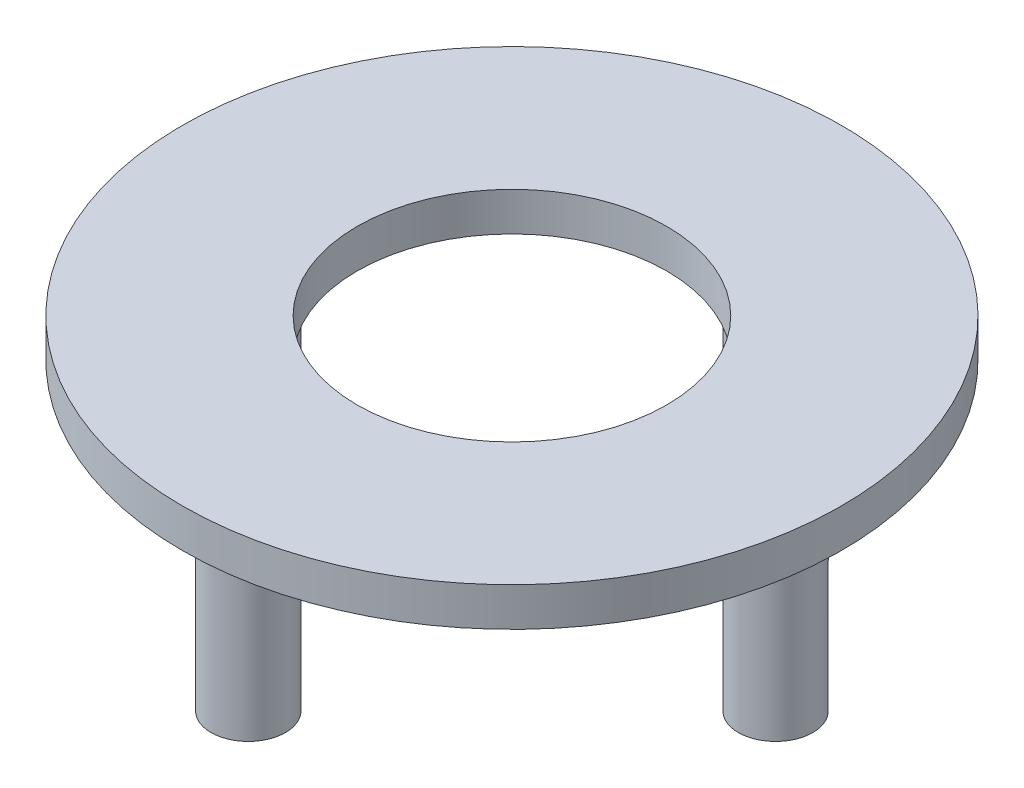
ISO-10303-21;
HEADER;
FILE_DESCRIPTION(('STEP AP214'),'2;1');
FILE_NAME('part.step','',(''),(''),'','','');
FILE_SCHEMA(('AUTOMOTIVE_DESIGN { 1 0 10303 214 1 1 1 1 }'));
ENDSEC;
DATA;
#1=APPLICATION_CONTEXT('core data for automotive mechanical design processes');
#2=APPLICATION_PROTOCOL_DEFINITION('international standard','automotive_design',2000,#1);
#3=PRODUCT_CONTEXT('',#1,'mechanical');
#4=PRODUCT('Part','Part','',(#3));
#5=PRODUCT_RELATED_PRODUCT_CATEGORY('part','',(#4));
#6=PRODUCT_DEFINITION_FORMATION('','',#4);
#7=PRODUCT_DEFINITION_CONTEXT('part definition',#1,'design');
#8=PRODUCT_DEFINITION('design','',#6,#7);
#9=PRODUCT_DEFINITION_SHAPE('','',#8);
#10=(LENGTH_UNIT() NAMED_UNIT(*) SI_UNIT(.MILLI.,.METRE.));
#11=(NAMED_UNIT(*) PLANE_ANGLE_UNIT() SI_UNIT($,.RADIAN.));
#12=(NAMED_UNIT(*) SI_UNIT($,.STERADIAN.) SOLID_ANGLE_UNIT());
#13=UNCERTAINTY_MEASURE_WITH_UNIT(LENGTH_MEASURE(1.E-05),#10,'distance_accuracy_value','');
#14=(GEOMETRIC_REPRESENTATION_CONTEXT(3) GLOBAL_UNCERTAINTY_ASSIGNED_CONTEXT((#13)) GLOBAL_UNIT_ASSIGNED_CONTEXT((#10,
#11,#12)) REPRESENTATION_CONTEXT('',''));
#15=CARTESIAN_POINT('',(0.,0.,0.));
#16=DIRECTION('',(0.,0.,1.));
#17=DIRECTION('',(1.,0.,0.));
#18=AXIS2_PLACEMENT_3D('',#15,#16,#17);
#19=CARTESIAN_POINT('',(0.,6.75,0.));
#20=DIRECTION('',(0.,1.,0.));
#21=DIRECTION('',(0.,0.,1.));
#22=AXIS2_PLACEMENT_3D('',#19,#20,#21);
#23=PLANE('',#22);
#24=CARTESIAN_POINT('',(0.,6.75,0.));
#25=DIRECTION('',(0.,1.,0.));
#26=DIRECTION('',(0.,0.,1.));
#27=AXIS2_PLACEMENT_3D('',#24,#25,#26);
#28=CIRCLE('',#27,57.5);
#29=CARTESIAN_POINT('',(0.,6.75,57.5));
#30=VERTEX_POINT('',#29);
#31=EDGE_CURVE('E56',#30,#30,#28,.T.);
#32=ORIENTED_EDGE('',*,*,#31,.T.);
#33=EDGE_LOOP('',(#32));
#34=FACE_BOUND('',#33,.T.);
#35=CARTESIAN_POINT('',(0.,6.75,0.));
#36=DIRECTION('',(0.,1.,0.));
#37=DIRECTION('',(0.,0.,1.));
#38=AXIS2_PLACEMENT_3D('',#35,#36,#37);
#39=CIRCLE('',#38,27.);
#40=CARTESIAN_POINT('',(0.,6.75,27.));
#41=VERTEX_POINT('',#40);
#42=EDGE_CURVE('E60',#41,#41,#39,.T.);
#43=ORIENTED_EDGE('',*,*,#42,.F.);
#44=EDGE_LOOP('',(#43));
#45=FACE_BOUND('',#44,.T.);
#46=ADVANCED_FACE('F36',(#34,#45),#23,.T.);
#47=CARTESIAN_POINT('',(0.,0.,0.));
#48=DIRECTION('',(0.,1.,0.));
#49=DIRECTION('',(0.,0.,1.));
#50=AXIS2_PLACEMENT_3D('',#47,#48,#49);
#51=PLANE('',#50);
#52=CARTESIAN_POINT('',(-46.,0.,0.));
#53=DIRECTION('',(0.,1.,0.));
#54=DIRECTION('',(0.,0.,1.));
#55=AXIS2_PLACEMENT_3D('',#52,#53,#54);
#56=CIRCLE('',#55,6.5);
#57=CARTESIAN_POINT('',(-46.,0.,6.5));
#58=VERTEX_POINT('',#57);
#59=EDGE_CURVE('E10',#58,#58,#56,.F.);
#60=ORIENTED_EDGE('',*,*,#59,.F.);
#61=EDGE_LOOP('',(#60));
#62=FACE_BOUND('',#61,.T.);
#63=CARTESIAN_POINT('',(46.,0.,0.));
#64=DIRECTION('',(0.,1.,0.));
#65=DIRECTION('',(0.,0.,1.));
#66=AXIS2_PLACEMENT_3D('',#63,#64,#65);
#67=CIRCLE('',#66,6.5);
#68=CARTESIAN_POINT('',(46.,0.,6.5));
#69=VERTEX_POINT('',#68);
#70=EDGE_CURVE('E43',#69,#69,#67,.F.);
#71=ORIENTED_EDGE('',*,*,#70,.F.);
#72=EDGE_LOOP('',(#71));
#73=FACE_BOUND('',#72,.T.);
#74=CARTESIAN_POINT('',(0.,0.,-46.));
#75=DIRECTION('',(0.,1.,0.));
#76=DIRECTION('',(0.,0.,1.));
#77=AXIS2_PLACEMENT_3D('',#74,#75,#76);
#78=CIRCLE('',#77,6.5);
#79=CARTESIAN_POINT('',(0.,0.,-39.5));
#80=VERTEX_POINT('',#79);
#81=EDGE_CURVE('E47',#80,#80,#78,.F.);
#82=ORIENTED_EDGE('',*,*,#81,.F.);
#83=EDGE_LOOP('',(#82));
#84=FACE_BOUND('',#83,.T.);
#85=CARTESIAN_POINT('',(0.,0.,46.));
#86=DIRECTION('',(0.,1.,0.));
#87=DIRECTION('',(0.,0.,1.));
#88=AXIS2_PLACEMENT_3D('',#85,#86,#87);
#89=CIRCLE('',#88,6.5);
#90=CARTESIAN_POINT('',(0.,0.,52.5));
#91=VERTEX_POINT('',#90);
#92=EDGE_CURVE('E51',#91,#91,#89,.F.);
#93=ORIENTED_EDGE('',*,*,#92,.F.);
#94=EDGE_LOOP('',(#93));
#95=FACE_BOUND('',#94,.T.);
#96=CARTESIAN_POINT('',(0.,0.,0.));
#97=DIRECTION('',(0.,1.,0.));
#98=DIRECTION('',(0.,0.,1.));
#99=AXIS2_PLACEMENT_3D('',#96,#97,#98);
#100=CIRCLE('',#99,57.5);
#101=CARTESIAN_POINT('',(0.,0.,57.5));
#102=VERTEX_POINT('',#101);
#103=EDGE_CURVE('E57',#102,#102,#100,.T.);
#104=ORIENTED_EDGE('',*,*,#103,.F.);
#105=EDGE_LOOP('',(#104));
#106=FACE_BOUND('',#105,.T.);
#107=CARTESIAN_POINT('',(0.,0.,0.));
#108=DIRECTION('',(0.,1.,0.));
#109=DIRECTION('',(0.,0.,1.));
#110=AXIS2_PLACEMENT_3D('',#107,#108,#109);
#111=CIRCLE('',#110,27.);
#112=CARTESIAN_POINT('',(0.,0.,27.));
#113=VERTEX_POINT('',#112);
#114=EDGE_CURVE('E63',#113,#113,#111,.T.);
#115=ORIENTED_EDGE('',*,*,#114,.T.);
#116=EDGE_LOOP('',(#115));
#117=FACE_BOUND('',#116,.T.);
#118=ADVANCED_FACE('F96',(#62,#73,#84,#95,#106,#117),#51,.F.);
#119=CARTESIAN_POINT('',(0.,6.75,0.));
#120=DIRECTION('',(0.,-1.,0.));
#121=DIRECTION('',(0.,0.,-1.));
#122=AXIS2_PLACEMENT_3D('',#119,#120,#121);
#123=CYLINDRICAL_SURFACE('',#122,57.5);
#124=ORIENTED_EDGE('',*,*,#31,.F.);
#125=EDGE_LOOP('',(#124));
#126=FACE_BOUND('',#125,.T.);
#127=ORIENTED_EDGE('',*,*,#103,.T.);
#128=EDGE_LOOP('',(#127));
#129=FACE_BOUND('',#128,.T.);
#130=ADVANCED_FACE('F38',(#126,#129),#123,.T.);
#131=CARTESIAN_POINT('',(0.,6.75,0.));
#132=DIRECTION('',(0.,-1.,0.));
#133=DIRECTION('',(0.,0.,-1.));
#134=AXIS2_PLACEMENT_3D('',#131,#132,#133);
#135=CYLINDRICAL_SURFACE('',#134,27.);
#136=ORIENTED_EDGE('',*,*,#42,.T.);
#137=EDGE_LOOP('',(#136));
#138=FACE_BOUND('',#137,.T.);
#139=ORIENTED_EDGE('',*,*,#114,.F.);
#140=EDGE_LOOP('',(#139));
#141=FACE_BOUND('',#140,.T.);
#142=ADVANCED_FACE('F105',(#138,#141),#135,.F.);
#143=CARTESIAN_POINT('',(0.,-30.,46.));
#144=DIRECTION('',(0.,1.,0.));
#145=DIRECTION('',(0.,0.,1.));
#146=AXIS2_PLACEMENT_3D('',#143,#144,#145);
#147=CYLINDRICAL_SURFACE('',#146,6.5);
#148=CARTESIAN_POINT('',(0.,-30.,46.));
#149=DIRECTION('',(0.,-1.,0.));
#150=DIRECTION('',(0.,0.,-1.));
#151=AXIS2_PLACEMENT_3D('',#148,#149,#150);
#152=CIRCLE('',#151,6.5);
#153=CARTESIAN_POINT('',(0.,-30.,39.5));
#154=VERTEX_POINT('',#153);
#155=EDGE_CURVE('E66',#154,#154,#152,.T.);
#156=ORIENTED_EDGE('',*,*,#155,.F.);
#157=EDGE_LOOP('',(#156));
#158=FACE_BOUND('',#157,.T.);
#159=ORIENTED_EDGE('',*,*,#92,.T.);
#160=EDGE_LOOP('',(#159));
#161=FACE_BOUND('',#160,.T.);
#162=ADVANCED_FACE('F108',(#158,#161),#147,.T.);
#163=CARTESIAN_POINT('',(0.,-30.,46.));
#164=DIRECTION('',(0.,-1.,0.));
#165=DIRECTION('',(0.,0.,-1.));
#166=AXIS2_PLACEMENT_3D('',#163,#164,#165);
#167=PLANE('',#166);
#168=ORIENTED_EDGE('',*,*,#155,.T.);
#169=EDGE_LOOP('',(#168));
#170=FACE_BOUND('',#169,.T.);
#171=ADVANCED_FACE('F112',(#170),#167,.T.);
#172=CARTESIAN_POINT('',(0.,-30.,-46.));
#173=DIRECTION('',(0.,1.,0.));
#174=DIRECTION('',(0.,0.,1.));
#175=AXIS2_PLACEMENT_3D('',#172,#173,#174);
#176=CYLINDRICAL_SURFACE('',#175,6.5);
#177=CARTESIAN_POINT('',(0.,-30.,-46.));
#178=DIRECTION('',(0.,-1.,0.));
#179=DIRECTION('',(0.,0.,-1.));
#180=AXIS2_PLACEMENT_3D('',#177,#178,#179);
#181=CIRCLE('',#180,6.5);
#182=CARTESIAN_POINT('',(0.,-30.,-52.5));
#183=VERTEX_POINT('',#182);
#184=EDGE_CURVE('E71',#183,#183,#181,.T.);
#185=ORIENTED_EDGE('',*,*,#184,.F.);
#186=EDGE_LOOP('',(#185));
#187=FACE_BOUND('',#186,.T.);
#188=ORIENTED_EDGE('',*,*,#81,.T.);
#189=EDGE_LOOP('',(#188));
#190=FACE_BOUND('',#189,.T.);
#191=ADVANCED_FACE('F116',(#187,#190),#176,.T.);
#192=CARTESIAN_POINT('',(0.,-30.,-46.));
#193=DIRECTION('',(0.,-1.,0.));
#194=DIRECTION('',(0.,0.,-1.));
#195=AXIS2_PLACEMENT_3D('',#192,#193,#194);
#196=PLANE('',#195);
#197=ORIENTED_EDGE('',*,*,#184,.T.);
#198=EDGE_LOOP('',(#197));
#199=FACE_BOUND('',#198,.T.);
#200=ADVANCED_FACE('F120',(#199),#196,.T.);
#201=CARTESIAN_POINT('',(46.,-30.,0.));
#202=DIRECTION('',(0.,1.,0.));
#203=DIRECTION('',(0.,0.,1.));
#204=AXIS2_PLACEMENT_3D('',#201,#202,#203);
#205=CYLINDRICAL_SURFACE('',#204,6.5);
#206=CARTESIAN_POINT('',(46.,-30.,0.));
#207=DIRECTION('',(0.,-1.,0.));
#208=DIRECTION('',(0.,0.,-1.));
#209=AXIS2_PLACEMENT_3D('',#206,#207,#208);
#210=CIRCLE('',#209,6.5);
#211=CARTESIAN_POINT('',(46.,-30.,-6.5));
#212=VERTEX_POINT('',#211);
#213=EDGE_CURVE('E74',#212,#212,#210,.T.);
#214=ORIENTED_EDGE('',*,*,#213,.F.);
#215=EDGE_LOOP('',(#214));
#216=FACE_BOUND('',#215,.T.);
#217=ORIENTED_EDGE('',*,*,#70,.T.);
#218=EDGE_LOOP('',(#217));
#219=FACE_BOUND('',#218,.T.);
#220=ADVANCED_FACE('F92',(#216,#219),#205,.T.);
#221=CARTESIAN_POINT('',(46.,-30.,0.));
#222=DIRECTION('',(0.,-1.,0.));
#223=DIRECTION('',(0.,0.,-1.));
#224=AXIS2_PLACEMENT_3D('',#221,#222,#223);
#225=PLANE('',#224);
#226=ORIENTED_EDGE('',*,*,#213,.T.);
#227=EDGE_LOOP('',(#226));
#228=FACE_BOUND('',#227,.T.);
#229=ADVANCED_FACE('F85',(#228),#225,.T.);
#230=CARTESIAN_POINT('',(-46.,-30.,0.));
#231=DIRECTION('',(0.,1.,0.));
#232=DIRECTION('',(0.,0.,1.));
#233=AXIS2_PLACEMENT_3D('',#230,#231,#232);
#234=CYLINDRICAL_SURFACE('',#233,6.5);
#235=CARTESIAN_POINT('',(-46.,-30.,0.));
#236=DIRECTION('',(0.,-1.,0.));
#237=DIRECTION('',(0.,0.,-1.));
#238=AXIS2_PLACEMENT_3D('',#235,#236,#237);
#239=CIRCLE('',#238,6.5);
#240=CARTESIAN_POINT('',(-46.,-30.,-6.5));
#241=VERTEX_POINT('',#240);
#242=EDGE_CURVE('E77',#241,#241,#239,.T.);
#243=ORIENTED_EDGE('',*,*,#242,.F.);
#244=EDGE_LOOP('',(#243));
#245=FACE_BOUND('',#244,.T.);
#246=ORIENTED_EDGE('',*,*,#59,.T.);
#247=EDGE_LOOP('',(#246));
#248=FACE_BOUND('',#247,.T.);
#249=ADVANCED_FACE('F83',(#245,#248),#234,.T.);
#250=CARTESIAN_POINT('',(-46.,-30.,0.));
#251=DIRECTION('',(0.,-1.,0.));
#252=DIRECTION('',(0.,0.,-1.));
#253=AXIS2_PLACEMENT_3D('',#250,#251,#252);
#254=PLANE('',#253);
#255=ORIENTED_EDGE('',*,*,#242,.T.);
#256=EDGE_LOOP('',(#255));
#257=FACE_BOUND('',#256,.T.);
#258=ADVANCED_FACE('F81',(#257),#254,.T.);
#259=CLOSED_SHELL('',(#46,#118,#130,#142,#162,#171,#191,#200,#220,#229,#249,#258));
#260=MANIFOLD_SOLID_BREP('B2',#259);
#261=ADVANCED_BREP_SHAPE_REPRESENTATION('',(#18,#260),#14);
#262=SHAPE_DEFINITION_REPRESENTATION(#9,#261);
ENDSEC;
END-ISO-10303-21;
